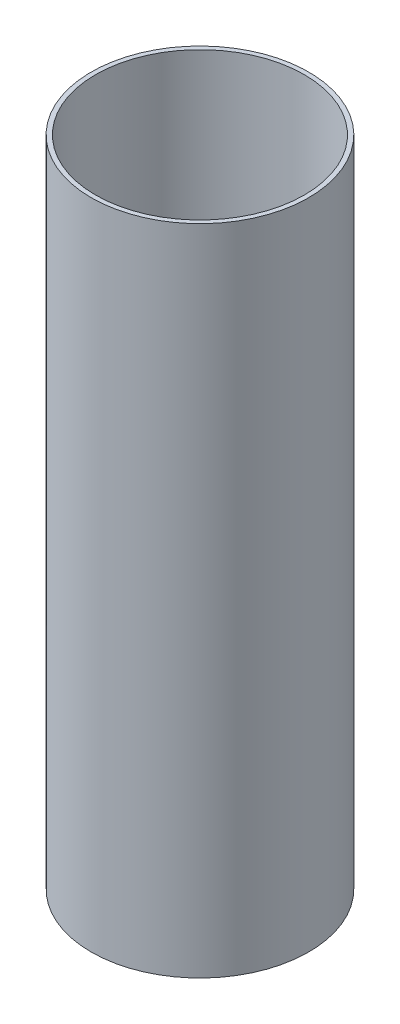
ISO-10303-21;
HEADER;
FILE_DESCRIPTION(('STEP AP214'),'2;1');
FILE_NAME('part.step','',(''),(''),'','','');
FILE_SCHEMA(('AUTOMOTIVE_DESIGN { 1 0 10303 214 1 1 1 1 }'));
ENDSEC;
DATA;
#1=APPLICATION_CONTEXT('core data for automotive mechanical design processes');
#2=APPLICATION_PROTOCOL_DEFINITION('international standard','automotive_design',2000,#1);
#3=PRODUCT_CONTEXT('',#1,'mechanical');
#4=PRODUCT('Part','Part','',(#3));
#5=PRODUCT_RELATED_PRODUCT_CATEGORY('part','',(#4));
#6=PRODUCT_DEFINITION_FORMATION('','',#4);
#7=PRODUCT_DEFINITION_CONTEXT('part definition',#1,'design');
#8=PRODUCT_DEFINITION('design','',#6,#7);
#9=PRODUCT_DEFINITION_SHAPE('','',#8);
#10=(LENGTH_UNIT() NAMED_UNIT(*) SI_UNIT(.MILLI.,.METRE.));
#11=(NAMED_UNIT(*) PLANE_ANGLE_UNIT() SI_UNIT($,.RADIAN.));
#12=(NAMED_UNIT(*) SI_UNIT($,.STERADIAN.) SOLID_ANGLE_UNIT());
#13=UNCERTAINTY_MEASURE_WITH_UNIT(LENGTH_MEASURE(1.E-05),#10,'distance_accuracy_value','');
#14=(GEOMETRIC_REPRESENTATION_CONTEXT(3) GLOBAL_UNCERTAINTY_ASSIGNED_CONTEXT((#13)) GLOBAL_UNIT_ASSIGNED_CONTEXT((#10,
#11,#12)) REPRESENTATION_CONTEXT('',''));
#15=CARTESIAN_POINT('',(0.,0.,0.));
#16=DIRECTION('',(0.,0.,1.));
#17=DIRECTION('',(1.,0.,0.));
#18=AXIS2_PLACEMENT_3D('',#15,#16,#17);
#19=CARTESIAN_POINT('',(0.,228.6,0.));
#20=DIRECTION('',(0.,1.,0.));
#21=DIRECTION('',(0.,0.,1.));
#22=AXIS2_PLACEMENT_3D('',#19,#20,#21);
#23=PLANE('',#22);
#24=CARTESIAN_POINT('',(0.,228.6,0.));
#25=DIRECTION('',(0.,1.,0.));
#26=DIRECTION('',(0.,0.,1.));
#27=AXIS2_PLACEMENT_3D('',#24,#25,#26);
#28=CIRCLE('',#27,38.0746);
#29=CARTESIAN_POINT('',(0.,228.6,38.0746));
#30=VERTEX_POINT('',#29);
#31=EDGE_CURVE('E10',#30,#30,#28,.T.);
#32=ORIENTED_EDGE('',*,*,#31,.T.);
#33=EDGE_LOOP('',(#32));
#34=FACE_BOUND('',#33,.T.);
#35=CARTESIAN_POINT('',(0.,228.6,0.));
#36=DIRECTION('',(0.,1.,0.));
#37=DIRECTION('',(0.,0.,1.));
#38=AXIS2_PLACEMENT_3D('',#35,#36,#37);
#39=CIRCLE('',#38,36.5125);
#40=CARTESIAN_POINT('',(0.,228.6,36.5125));
#41=VERTEX_POINT('',#40);
#42=EDGE_CURVE('E56',#41,#41,#39,.T.);
#43=ORIENTED_EDGE('',*,*,#42,.F.);
#44=EDGE_LOOP('',(#43));
#45=FACE_BOUND('',#44,.T.);
#46=ADVANCED_FACE('F43',(#34,#45),#23,.T.);
#47=CARTESIAN_POINT('',(0.,0.,0.));
#48=DIRECTION('',(0.,1.,0.));
#49=DIRECTION('',(0.,0.,1.));
#50=AXIS2_PLACEMENT_3D('',#47,#48,#49);
#51=PLANE('',#50);
#52=CARTESIAN_POINT('',(0.,0.,0.));
#53=DIRECTION('',(0.,1.,0.));
#54=DIRECTION('',(0.,0.,1.));
#55=AXIS2_PLACEMENT_3D('',#52,#53,#54);
#56=CIRCLE('',#55,38.0746);
#57=CARTESIAN_POINT('',(0.,0.,38.0746));
#58=VERTEX_POINT('',#57);
#59=EDGE_CURVE('E47',#58,#58,#56,.T.);
#60=ORIENTED_EDGE('',*,*,#59,.F.);
#61=EDGE_LOOP('',(#60));
#62=FACE_BOUND('',#61,.T.);
#63=CARTESIAN_POINT('',(0.,0.,0.));
#64=DIRECTION('',(0.,1.,0.));
#65=DIRECTION('',(0.,0.,1.));
#66=AXIS2_PLACEMENT_3D('',#63,#64,#65);
#67=CIRCLE('',#66,36.5125);
#68=CARTESIAN_POINT('',(0.,0.,36.5125));
#69=VERTEX_POINT('',#68);
#70=EDGE_CURVE('E58',#69,#69,#67,.T.);
#71=ORIENTED_EDGE('',*,*,#70,.T.);
#72=EDGE_LOOP('',(#71));
#73=FACE_BOUND('',#72,.T.);
#74=ADVANCED_FACE('F70',(#62,#73),#51,.F.);
#75=CARTESIAN_POINT('',(0.,228.6,0.));
#76=DIRECTION('',(0.,-1.,0.));
#77=DIRECTION('',(0.,0.,-1.));
#78=AXIS2_PLACEMENT_3D('',#75,#76,#77);
#79=CYLINDRICAL_SURFACE('',#78,38.0746);
#80=ORIENTED_EDGE('',*,*,#31,.F.);
#81=EDGE_LOOP('',(#80));
#82=FACE_BOUND('',#81,.T.);
#83=ORIENTED_EDGE('',*,*,#59,.T.);
#84=EDGE_LOOP('',(#83));
#85=FACE_BOUND('',#84,.T.);
#86=ADVANCED_FACE('F45',(#82,#85),#79,.T.);
#87=CARTESIAN_POINT('',(0.,228.6,0.));
#88=DIRECTION('',(0.,-1.,0.));
#89=DIRECTION('',(0.,0.,-1.));
#90=AXIS2_PLACEMENT_3D('',#87,#88,#89);
#91=CYLINDRICAL_SURFACE('',#90,36.5125);
#92=ORIENTED_EDGE('',*,*,#42,.T.);
#93=EDGE_LOOP('',(#92));
#94=FACE_BOUND('',#93,.T.);
#95=ORIENTED_EDGE('',*,*,#70,.F.);
#96=EDGE_LOOP('',(#95));
#97=FACE_BOUND('',#96,.T.);
#98=ADVANCED_FACE('F66',(#94,#97),#91,.F.);
#99=CLOSED_SHELL('',(#46,#74,#86,#98));
#100=MANIFOLD_SOLID_BREP('B2',#99);
#101=ADVANCED_BREP_SHAPE_REPRESENTATION('',(#18,#100),#14);
#102=SHAPE_DEFINITION_REPRESENTATION(#9,#101);
ENDSEC;
END-ISO-10303-21;
